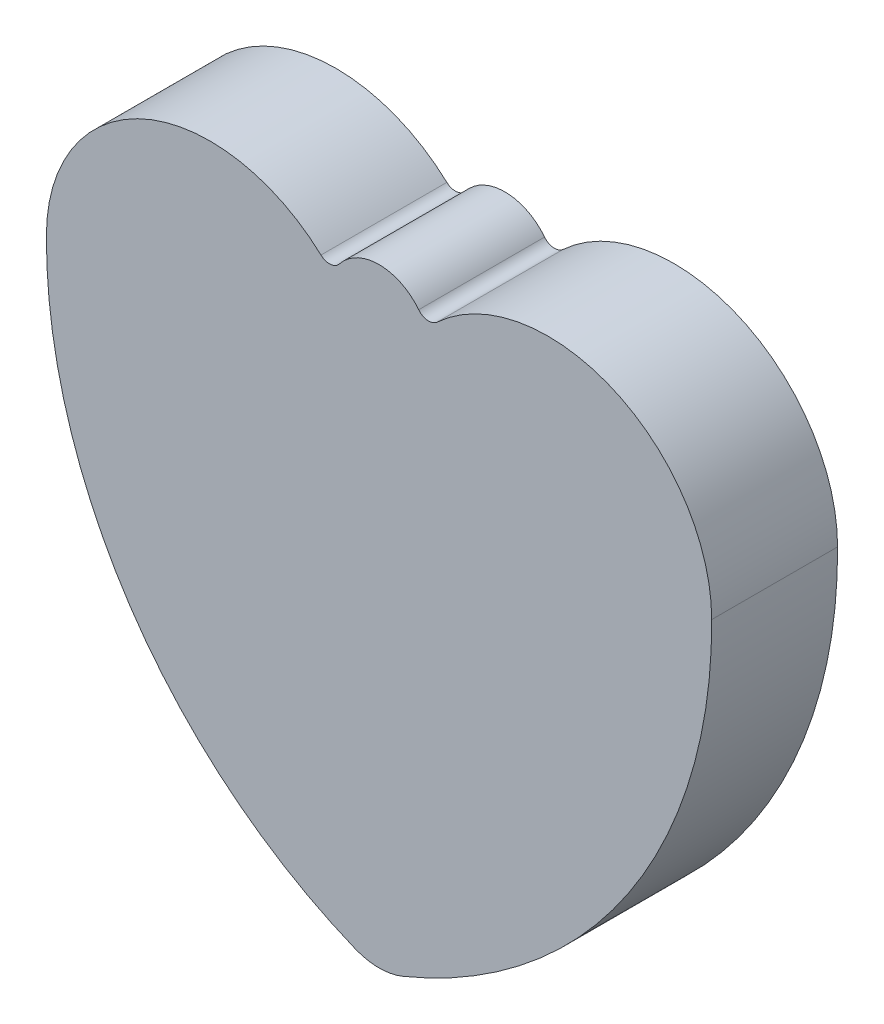
ISO-10303-21;
HEADER;
FILE_DESCRIPTION(('STEP AP214'),'2;1');
FILE_NAME('part.step','',(''),(''),'','','');
FILE_SCHEMA(('AUTOMOTIVE_DESIGN { 1 0 10303 214 1 1 1 1 }'));
ENDSEC;
DATA;
#1=APPLICATION_CONTEXT('core data for automotive mechanical design processes');
#2=APPLICATION_PROTOCOL_DEFINITION('international standard','automotive_design',2000,#1);
#3=PRODUCT_CONTEXT('',#1,'mechanical');
#4=PRODUCT('Part','Part','',(#3));
#5=PRODUCT_RELATED_PRODUCT_CATEGORY('part','',(#4));
#6=PRODUCT_DEFINITION_FORMATION('','',#4);
#7=PRODUCT_DEFINITION_CONTEXT('part definition',#1,'design');
#8=PRODUCT_DEFINITION('design','',#6,#7);
#9=PRODUCT_DEFINITION_SHAPE('','',#8);
#10=(LENGTH_UNIT() NAMED_UNIT(*) SI_UNIT(.MILLI.,.METRE.));
#11=(NAMED_UNIT(*) PLANE_ANGLE_UNIT() SI_UNIT($,.RADIAN.));
#12=(NAMED_UNIT(*) SI_UNIT($,.STERADIAN.) SOLID_ANGLE_UNIT());
#13=UNCERTAINTY_MEASURE_WITH_UNIT(LENGTH_MEASURE(1.E-05),#10,'distance_accuracy_value','');
#14=(GEOMETRIC_REPRESENTATION_CONTEXT(3) GLOBAL_UNCERTAINTY_ASSIGNED_CONTEXT((#13)) GLOBAL_UNIT_ASSIGNED_CONTEXT((#10,
#11,#12)) REPRESENTATION_CONTEXT('',''));
#15=CARTESIAN_POINT('',(0.,0.,0.));
#16=DIRECTION('',(0.,0.,1.));
#17=DIRECTION('',(1.,0.,0.));
#18=AXIS2_PLACEMENT_3D('',#15,#16,#17);
#19=CARTESIAN_POINT('',(3.54382030606076,21.5304702524517,9.5));
#20=DIRECTION('',(0.,0.,-1.));
#21=DIRECTION('',(-1.,0.,0.));
#22=AXIS2_PLACEMENT_3D('',#19,#20,#21);
#23=CYLINDRICAL_SURFACE('',#22,0.9);
#24=CARTESIAN_POINT('',(3.54382030606076,21.5304702524517,0.500000000000001));
#25=DIRECTION('',(0.,0.,-1.));
#26=DIRECTION('',(-1.,0.,0.));
#27=AXIS2_PLACEMENT_3D('',#24,#25,#26);
#28=CIRCLE('',#27,0.9);
#29=CARTESIAN_POINT('',(4.15378181698613,20.8686946445681,0.500000000000001));
#30=VERTEX_POINT('',#29);
#31=CARTESIAN_POINT('',(2.83505624484861,20.975805033122,0.500000000000001));
#32=VERTEX_POINT('',#31);
#33=EDGE_CURVE('E131',#30,#32,#28,.T.);
#34=ORIENTED_EDGE('',*,*,#33,.T.);
#35=DIRECTION('',(0.,0.,-1.));
#36=VECTOR('',#35,1.);
#37=CARTESIAN_POINT('',(2.83505624484861,20.975805033122,9.5));
#38=LINE('',#37,#36);
#39=CARTESIAN_POINT('',(2.83505624484861,20.975805033122,9.5));
#40=VERTEX_POINT('',#39);
#41=EDGE_CURVE('E11',#40,#32,#38,.T.);
#42=ORIENTED_EDGE('',*,*,#41,.F.);
#43=CARTESIAN_POINT('',(3.54382030606076,21.5304702524517,9.5));
#44=DIRECTION('',(0.,0.,-1.));
#45=DIRECTION('',(-1.,0.,0.));
#46=AXIS2_PLACEMENT_3D('',#43,#44,#45);
#47=CIRCLE('',#46,0.9);
#48=CARTESIAN_POINT('',(4.15378181698613,20.8686946445681,9.5));
#49=VERTEX_POINT('',#48);
#50=EDGE_CURVE('E145',#49,#40,#47,.T.);
#51=ORIENTED_EDGE('',*,*,#50,.F.);
#52=DIRECTION('',(0.,0.,-1.));
#53=VECTOR('',#52,1.);
#54=CARTESIAN_POINT('',(4.15378181698613,20.8686946445681,9.5));
#55=LINE('',#54,#53);
#56=EDGE_CURVE('E127',#49,#30,#55,.T.);
#57=ORIENTED_EDGE('',*,*,#56,.T.);
#58=EDGE_LOOP('',(#34,#42,#51,#57));
#59=FACE_BOUND('',#58,.T.);
#60=ADVANCED_FACE('F35',(#59),#23,.F.);
#61=CARTESIAN_POINT('',(0.,18.7571441558032,9.5));
#62=DIRECTION('',(0.,0.,-1.));
#63=DIRECTION('',(-1.,0.,0.));
#64=AXIS2_PLACEMENT_3D('',#61,#62,#63);
#65=CYLINDRICAL_SURFACE('',#64,3.6);
#66=CARTESIAN_POINT('',(0.,18.7571441558032,0.500000000000001));
#67=DIRECTION('',(0.,0.,1.));
#68=DIRECTION('',(-1.,0.,0.));
#69=AXIS2_PLACEMENT_3D('',#66,#67,#68);
#70=CIRCLE('',#69,3.6);
#71=CARTESIAN_POINT('',(-2.8350562448486,20.975805033122,0.500000000000001));
#72=VERTEX_POINT('',#71);
#73=EDGE_CURVE('E134',#32,#72,#70,.T.);
#74=ORIENTED_EDGE('',*,*,#73,.T.);
#75=DIRECTION('',(0.,0.,-1.));
#76=VECTOR('',#75,1.);
#77=CARTESIAN_POINT('',(-2.8350562448486,20.975805033122,9.5));
#78=LINE('',#77,#76);
#79=CARTESIAN_POINT('',(-2.8350562448486,20.975805033122,9.5));
#80=VERTEX_POINT('',#79);
#81=EDGE_CURVE('E43',#80,#72,#78,.T.);
#82=ORIENTED_EDGE('',*,*,#81,.F.);
#83=CARTESIAN_POINT('',(0.,18.7571441558032,9.5));
#84=DIRECTION('',(0.,0.,1.));
#85=DIRECTION('',(-1.,0.,0.));
#86=AXIS2_PLACEMENT_3D('',#83,#84,#85);
#87=CIRCLE('',#86,3.6);
#88=EDGE_CURVE('E94',#40,#80,#87,.T.);
#89=ORIENTED_EDGE('',*,*,#88,.F.);
#90=ORIENTED_EDGE('',*,*,#41,.T.);
#91=EDGE_LOOP('',(#74,#82,#89,#90));
#92=FACE_BOUND('',#91,.T.);
#93=ADVANCED_FACE('F180',(#92),#65,.T.);
#94=CARTESIAN_POINT('',(-3.54382030606075,21.5304702524517,9.5));
#95=DIRECTION('',(0.,0.,-1.));
#96=DIRECTION('',(-1.,0.,0.));
#97=AXIS2_PLACEMENT_3D('',#94,#95,#96);
#98=CYLINDRICAL_SURFACE('',#97,0.9);
#99=CARTESIAN_POINT('',(-3.54382030606075,21.5304702524517,0.500000000000001));
#100=DIRECTION('',(0.,0.,-1.));
#101=DIRECTION('',(-1.,0.,0.));
#102=AXIS2_PLACEMENT_3D('',#99,#100,#101);
#103=CIRCLE('',#102,0.9);
#104=CARTESIAN_POINT('',(-4.15378181698613,20.8686946445681,0.500000000000001));
#105=VERTEX_POINT('',#104);
#106=EDGE_CURVE('E136',#72,#105,#103,.T.);
#107=ORIENTED_EDGE('',*,*,#106,.T.);
#108=DIRECTION('',(0.,0.,-1.));
#109=VECTOR('',#108,1.);
#110=CARTESIAN_POINT('',(-4.15378181698613,20.8686946445681,9.5));
#111=LINE('',#110,#109);
#112=CARTESIAN_POINT('',(-4.15378181698613,20.8686946445681,9.5));
#113=VERTEX_POINT('',#112);
#114=EDGE_CURVE('E152',#113,#105,#111,.T.);
#115=ORIENTED_EDGE('',*,*,#114,.F.);
#116=CARTESIAN_POINT('',(-3.54382030606075,21.5304702524517,9.5));
#117=DIRECTION('',(0.,0.,-1.));
#118=DIRECTION('',(-1.,0.,0.));
#119=AXIS2_PLACEMENT_3D('',#116,#117,#118);
#120=CIRCLE('',#119,0.9);
#121=EDGE_CURVE('E160',#80,#113,#120,.T.);
#122=ORIENTED_EDGE('',*,*,#121,.F.);
#123=ORIENTED_EDGE('',*,*,#81,.T.);
#124=EDGE_LOOP('',(#107,#115,#122,#123));
#125=FACE_BOUND('',#124,.T.);
#126=ADVANCED_FACE('F158',(#125),#98,.F.);
#127=CARTESIAN_POINT('',(-12.083281459016,12.265611742082,9.5));
#128=DIRECTION('',(0.,0.,-1.));
#129=DIRECTION('',(-1.,0.,0.));
#130=AXIS2_PLACEMENT_3D('',#127,#128,#129);
#131=CYLINDRICAL_SURFACE('',#130,11.7);
#132=CARTESIAN_POINT('',(-12.083281459016,12.265611742082,0.500000000000001));
#133=DIRECTION('',(0.,0.,1.));
#134=DIRECTION('',(1.,0.,0.));
#135=AXIS2_PLACEMENT_3D('',#132,#133,#134);
#136=CIRCLE('',#135,11.7);
#137=CARTESIAN_POINT('',(-23.783281459016,12.265611742082,0.500000000000001));
#138=VERTEX_POINT('',#137);
#139=EDGE_CURVE('E138',#105,#138,#136,.T.);
#140=ORIENTED_EDGE('',*,*,#139,.T.);
#141=DIRECTION('',(0.,0.,-1.));
#142=VECTOR('',#141,1.);
#143=CARTESIAN_POINT('',(-23.783281459016,12.265611742082,9.5));
#144=LINE('',#143,#142);
#145=CARTESIAN_POINT('',(-23.783281459016,12.265611742082,9.5));
#146=VERTEX_POINT('',#145);
#147=EDGE_CURVE('E149',#146,#138,#144,.T.);
#148=ORIENTED_EDGE('',*,*,#147,.F.);
#149=CARTESIAN_POINT('',(-12.083281459016,12.265611742082,9.5));
#150=DIRECTION('',(0.,0.,1.));
#151=DIRECTION('',(1.,0.,0.));
#152=AXIS2_PLACEMENT_3D('',#149,#150,#151);
#153=CIRCLE('',#152,11.7);
#154=EDGE_CURVE('E172',#113,#146,#153,.T.);
#155=ORIENTED_EDGE('',*,*,#154,.F.);
#156=ORIENTED_EDGE('',*,*,#114,.T.);
#157=EDGE_LOOP('',(#140,#148,#155,#156));
#158=FACE_BOUND('',#157,.T.);
#159=ADVANCED_FACE('F168',(#158),#131,.T.);
#160=CARTESIAN_POINT('',(11.7822728466436,12.0450403269866,9.5));
#161=DIRECTION('',(0.,0.,-1.));
#162=DIRECTION('',(-1.,0.,0.));
#163=AXIS2_PLACEMENT_3D('',#160,#161,#162);
#164=CYLINDRICAL_SURFACE('',#163,35.566238271962);
#165=CARTESIAN_POINT('',(11.7822728466436,12.0450403269866,0.500000000000001));
#166=DIRECTION('',(0.,0.,1.));
#167=DIRECTION('',(-1.,0.,0.));
#168=AXIS2_PLACEMENT_3D('',#165,#166,#167);
#169=CIRCLE('',#168,35.566238271962);
#170=CARTESIAN_POINT('',(-1.70668322780965,-20.8640065877972,0.500000000000001));
#171=VERTEX_POINT('',#170);
#172=EDGE_CURVE('E140',#138,#171,#169,.T.);
#173=ORIENTED_EDGE('',*,*,#172,.T.);
#174=DIRECTION('',(0.,0.,-1.));
#175=VECTOR('',#174,1.);
#176=CARTESIAN_POINT('',(-1.70668322780965,-20.8640065877972,9.5));
#177=LINE('',#176,#175);
#178=CARTESIAN_POINT('',(-1.70668322780965,-20.8640065877972,9.5));
#179=VERTEX_POINT('',#178);
#180=EDGE_CURVE('E122',#179,#171,#177,.T.);
#181=ORIENTED_EDGE('',*,*,#180,.F.);
#182=CARTESIAN_POINT('',(11.7822728466436,12.0450403269866,9.5));
#183=DIRECTION('',(0.,0.,1.));
#184=DIRECTION('',(-1.,0.,0.));
#185=AXIS2_PLACEMENT_3D('',#182,#183,#184);
#186=CIRCLE('',#185,35.566238271962);
#187=EDGE_CURVE('E113',#146,#179,#186,.T.);
#188=ORIENTED_EDGE('',*,*,#187,.F.);
#189=ORIENTED_EDGE('',*,*,#147,.T.);
#190=EDGE_LOOP('',(#173,#181,#188,#189));
#191=FACE_BOUND('',#190,.T.);
#192=ADVANCED_FACE('F171',(#191),#164,.T.);
#193=CARTESIAN_POINT('',(0.,-16.7002063572491,9.5));
#194=DIRECTION('',(0.,0.,-1.));
#195=DIRECTION('',(-1.,0.,0.));
#196=AXIS2_PLACEMENT_3D('',#193,#194,#195);
#197=CYLINDRICAL_SURFACE('',#196,4.5);
#198=CARTESIAN_POINT('',(0.,-16.7002063572491,0.500000000000001));
#199=DIRECTION('',(0.,0.,1.));
#200=DIRECTION('',(-1.,0.,0.));
#201=AXIS2_PLACEMENT_3D('',#198,#199,#200);
#202=CIRCLE('',#201,4.5);
#203=CARTESIAN_POINT('',(1.70668322780964,-20.8640065877973,0.500000000000001));
#204=VERTEX_POINT('',#203);
#205=EDGE_CURVE('E121',#171,#204,#202,.T.);
#206=ORIENTED_EDGE('',*,*,#205,.T.);
#207=DIRECTION('',(0.,0.,-1.));
#208=VECTOR('',#207,1.);
#209=CARTESIAN_POINT('',(1.70668322780964,-20.8640065877973,9.5));
#210=LINE('',#209,#208);
#211=CARTESIAN_POINT('',(1.70668322780964,-20.8640065877973,9.5));
#212=VERTEX_POINT('',#211);
#213=EDGE_CURVE('E118',#212,#204,#210,.T.);
#214=ORIENTED_EDGE('',*,*,#213,.F.);
#215=CARTESIAN_POINT('',(0.,-16.7002063572491,9.5));
#216=DIRECTION('',(0.,0.,1.));
#217=DIRECTION('',(-1.,0.,0.));
#218=AXIS2_PLACEMENT_3D('',#215,#216,#217);
#219=CIRCLE('',#218,4.5);
#220=EDGE_CURVE('E107',#179,#212,#219,.T.);
#221=ORIENTED_EDGE('',*,*,#220,.F.);
#222=ORIENTED_EDGE('',*,*,#180,.T.);
#223=EDGE_LOOP('',(#206,#214,#221,#222));
#224=FACE_BOUND('',#223,.T.);
#225=ADVANCED_FACE('F119',(#224),#197,.T.);
#226=CARTESIAN_POINT('',(-11.7822728466436,12.0450403269866,9.5));
#227=DIRECTION('',(0.,0.,-1.));
#228=DIRECTION('',(-1.,0.,0.));
#229=AXIS2_PLACEMENT_3D('',#226,#227,#228);
#230=CYLINDRICAL_SURFACE('',#229,35.566238271962);
#231=CARTESIAN_POINT('',(-11.7822728466436,12.0450403269866,0.500000000000001));
#232=DIRECTION('',(0.,0.,1.));
#233=DIRECTION('',(1.,0.,0.));
#234=AXIS2_PLACEMENT_3D('',#231,#232,#233);
#235=CIRCLE('',#234,35.566238271962);
#236=CARTESIAN_POINT('',(23.783281459016,12.265611742082,0.500000000000001));
#237=VERTEX_POINT('',#236);
#238=EDGE_CURVE('E80',#204,#237,#235,.T.);
#239=ORIENTED_EDGE('',*,*,#238,.T.);
#240=DIRECTION('',(0.,0.,-1.));
#241=VECTOR('',#240,1.);
#242=CARTESIAN_POINT('',(23.783281459016,12.265611742082,9.5));
#243=LINE('',#242,#241);
#244=CARTESIAN_POINT('',(23.783281459016,12.265611742082,9.5));
#245=VERTEX_POINT('',#244);
#246=EDGE_CURVE('E123',#245,#237,#243,.T.);
#247=ORIENTED_EDGE('',*,*,#246,.F.);
#248=CARTESIAN_POINT('',(-11.7822728466436,12.0450403269866,9.5));
#249=DIRECTION('',(0.,0.,1.));
#250=DIRECTION('',(1.,0.,0.));
#251=AXIS2_PLACEMENT_3D('',#248,#249,#250);
#252=CIRCLE('',#251,35.566238271962);
#253=EDGE_CURVE('E111',#212,#245,#252,.T.);
#254=ORIENTED_EDGE('',*,*,#253,.F.);
#255=ORIENTED_EDGE('',*,*,#213,.T.);
#256=EDGE_LOOP('',(#239,#247,#254,#255));
#257=FACE_BOUND('',#256,.T.);
#258=ADVANCED_FACE('F125',(#257),#230,.T.);
#259=CARTESIAN_POINT('',(12.083281459016,12.265611742082,9.5));
#260=DIRECTION('',(0.,0.,-1.));
#261=DIRECTION('',(-1.,0.,0.));
#262=AXIS2_PLACEMENT_3D('',#259,#260,#261);
#263=CYLINDRICAL_SURFACE('',#262,11.7);
#264=CARTESIAN_POINT('',(12.083281459016,12.265611742082,0.500000000000001));
#265=DIRECTION('',(0.,0.,1.));
#266=DIRECTION('',(-1.,0.,0.));
#267=AXIS2_PLACEMENT_3D('',#264,#265,#266);
#268=CIRCLE('',#267,11.7);
#269=EDGE_CURVE('E86',#237,#30,#268,.T.);
#270=ORIENTED_EDGE('',*,*,#269,.T.);
#271=ORIENTED_EDGE('',*,*,#56,.F.);
#272=CARTESIAN_POINT('',(12.083281459016,12.265611742082,9.5));
#273=DIRECTION('',(0.,0.,1.));
#274=DIRECTION('',(-1.,0.,0.));
#275=AXIS2_PLACEMENT_3D('',#272,#273,#274);
#276=CIRCLE('',#275,11.7);
#277=EDGE_CURVE('E51',#245,#49,#276,.T.);
#278=ORIENTED_EDGE('',*,*,#277,.F.);
#279=ORIENTED_EDGE('',*,*,#246,.T.);
#280=EDGE_LOOP('',(#270,#271,#278,#279));
#281=FACE_BOUND('',#280,.T.);
#282=ADVANCED_FACE('F196',(#281),#263,.T.);
#283=CARTESIAN_POINT('',(1.77191015303038,20.1438072041274,9.5));
#284=DIRECTION('',(0.,0.,-1.));
#285=DIRECTION('',(-1.,0.,0.));
#286=AXIS2_PLACEMENT_3D('',#283,#284,#285);
#287=PLANE('',#286);
#288=ORIENTED_EDGE('',*,*,#50,.T.);
#289=ORIENTED_EDGE('',*,*,#88,.T.);
#290=ORIENTED_EDGE('',*,*,#121,.T.);
#291=ORIENTED_EDGE('',*,*,#154,.T.);
#292=ORIENTED_EDGE('',*,*,#187,.T.);
#293=ORIENTED_EDGE('',*,*,#220,.T.);
#294=ORIENTED_EDGE('',*,*,#253,.T.);
#295=ORIENTED_EDGE('',*,*,#277,.T.);
#296=EDGE_LOOP('',(#288,#289,#290,#291,#292,#293,#294,#295));
#297=FACE_BOUND('',#296,.T.);
#298=ADVANCED_FACE('F109',(#297),#287,.F.);
#299=CARTESIAN_POINT('',(1.77191015303038,20.1438072041274,0.500000000000001));
#300=DIRECTION('',(0.,0.,-1.));
#301=DIRECTION('',(-1.,0.,0.));
#302=AXIS2_PLACEMENT_3D('',#299,#300,#301);
#303=PLANE('',#302);
#304=ORIENTED_EDGE('',*,*,#33,.F.);
#305=ORIENTED_EDGE('',*,*,#269,.F.);
#306=ORIENTED_EDGE('',*,*,#238,.F.);
#307=ORIENTED_EDGE('',*,*,#205,.F.);
#308=ORIENTED_EDGE('',*,*,#172,.F.);
#309=ORIENTED_EDGE('',*,*,#139,.F.);
#310=ORIENTED_EDGE('',*,*,#106,.F.);
#311=ORIENTED_EDGE('',*,*,#73,.F.);
#312=EDGE_LOOP('',(#304,#305,#306,#307,#308,#309,#310,#311));
#313=FACE_BOUND('',#312,.T.);
#314=ADVANCED_FACE('F164',(#313),#303,.T.);
#315=CLOSED_SHELL('',(#60,#93,#126,#159,#192,#225,#258,#282,#298,#314));
#316=MANIFOLD_SOLID_BREP('B2',#315);
#317=ADVANCED_BREP_SHAPE_REPRESENTATION('',(#18,#316),#14);
#318=SHAPE_DEFINITION_REPRESENTATION(#9,#317);
ENDSEC;
END-ISO-10303-21;
